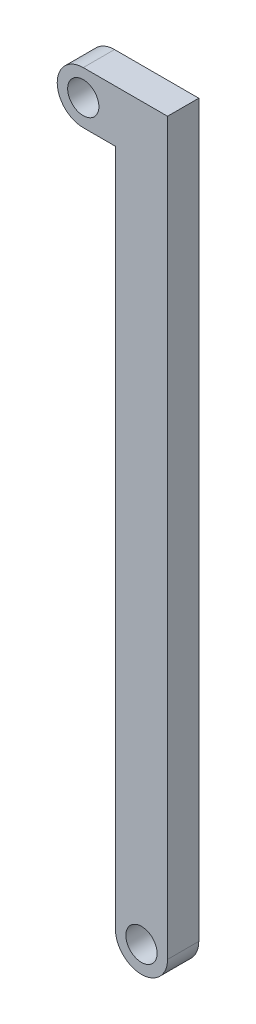
ISO-10303-21;
HEADER;
FILE_DESCRIPTION(('STEP AP214'),'2;1');
FILE_NAME('part.step','',(''),(''),'','','');
FILE_SCHEMA(('AUTOMOTIVE_DESIGN { 1 0 10303 214 1 1 1 1 }'));
ENDSEC;
DATA;
#1=APPLICATION_CONTEXT('core data for automotive mechanical design processes');
#2=APPLICATION_PROTOCOL_DEFINITION('international standard','automotive_design',2000,#1);
#3=PRODUCT_CONTEXT('',#1,'mechanical');
#4=PRODUCT('Part','Part','',(#3));
#5=PRODUCT_RELATED_PRODUCT_CATEGORY('part','',(#4));
#6=PRODUCT_DEFINITION_FORMATION('','',#4);
#7=PRODUCT_DEFINITION_CONTEXT('part definition',#1,'design');
#8=PRODUCT_DEFINITION('design','',#6,#7);
#9=PRODUCT_DEFINITION_SHAPE('','',#8);
#10=(LENGTH_UNIT() NAMED_UNIT(*) SI_UNIT(.MILLI.,.METRE.));
#11=(NAMED_UNIT(*) PLANE_ANGLE_UNIT() SI_UNIT($,.RADIAN.));
#12=(NAMED_UNIT(*) SI_UNIT($,.STERADIAN.) SOLID_ANGLE_UNIT());
#13=UNCERTAINTY_MEASURE_WITH_UNIT(LENGTH_MEASURE(1.E-05),#10,'distance_accuracy_value','');
#14=(GEOMETRIC_REPRESENTATION_CONTEXT(3) GLOBAL_UNCERTAINTY_ASSIGNED_CONTEXT((#13)) GLOBAL_UNIT_ASSIGNED_CONTEXT((#10,
#11,#12)) REPRESENTATION_CONTEXT('',''));
#15=CARTESIAN_POINT('',(0.,0.,0.));
#16=DIRECTION('',(0.,0.,1.));
#17=DIRECTION('',(1.,0.,0.));
#18=AXIS2_PLACEMENT_3D('',#15,#16,#17);
#19=CARTESIAN_POINT('',(-119.563888888889,71.4277777777778,30.));
#20=DIRECTION('',(0.,0.,-1.));
#21=DIRECTION('',(-1.,0.,0.));
#22=AXIS2_PLACEMENT_3D('',#19,#20,#21);
#23=PLANE('',#22);
#24=CARTESIAN_POINT('',(-119.563888888889,71.4277777777778,30.));
#25=DIRECTION('',(0.,0.,1.));
#26=DIRECTION('',(-1.,0.,0.));
#27=AXIS2_PLACEMENT_3D('',#24,#25,#26);
#28=CIRCLE('',#27,25.);
#29=CARTESIAN_POINT('',(-119.563888888889,96.4277777777778,30.));
#30=VERTEX_POINT('',#29);
#31=CARTESIAN_POINT('',(-119.563888888889,46.4277777777778,30.));
#32=VERTEX_POINT('',#31);
#33=EDGE_CURVE('E133',#30,#32,#28,.T.);
#34=ORIENTED_EDGE('',*,*,#33,.T.);
#35=DIRECTION('',(1.,0.,0.));
#36=VECTOR('',#35,1.);
#37=CARTESIAN_POINT('',(-119.563888888889,46.4277777777778,30.));
#38=LINE('',#37,#36);
#39=CARTESIAN_POINT('',(-88.663888888889,46.4277777777778,30.));
#40=VERTEX_POINT('',#39);
#41=EDGE_CURVE('E91',#32,#40,#38,.T.);
#42=ORIENTED_EDGE('',*,*,#41,.T.);
#43=DIRECTION('',(0.,-1.,0.));
#44=VECTOR('',#43,1.);
#45=CARTESIAN_POINT('',(-88.663888888889,46.4277777777778,30.));
#46=LINE('',#45,#44);
#47=CARTESIAN_POINT('',(-88.663888888889,-604.572222222222,30.));
#48=VERTEX_POINT('',#47);
#49=EDGE_CURVE('E104',#40,#48,#46,.T.);
#50=ORIENTED_EDGE('',*,*,#49,.T.);
#51=CARTESIAN_POINT('',(-63.6638888888889,-604.572222222222,30.));
#52=DIRECTION('',(0.,0.,1.));
#53=DIRECTION('',(1.,0.,0.));
#54=AXIS2_PLACEMENT_3D('',#51,#52,#53);
#55=CIRCLE('',#54,25.);
#56=CARTESIAN_POINT('',(-38.6638888888889,-604.572222222222,30.));
#57=VERTEX_POINT('',#56);
#58=EDGE_CURVE('E98',#48,#57,#55,.T.);
#59=ORIENTED_EDGE('',*,*,#58,.T.);
#60=DIRECTION('',(0.,1.,0.));
#61=VECTOR('',#60,1.);
#62=CARTESIAN_POINT('',(-38.663888888889,96.4277777777778,30.));
#63=LINE('',#62,#61);
#64=CARTESIAN_POINT('',(-38.663888888889,96.4277777777778,30.));
#65=VERTEX_POINT('',#64);
#66=EDGE_CURVE('E102',#57,#65,#63,.T.);
#67=ORIENTED_EDGE('',*,*,#66,.T.);
#68=DIRECTION('',(-1.,0.,0.));
#69=VECTOR('',#68,1.);
#70=CARTESIAN_POINT('',(-119.563888888889,96.4277777777778,30.));
#71=LINE('',#70,#69);
#72=EDGE_CURVE('E54',#65,#30,#71,.T.);
#73=ORIENTED_EDGE('',*,*,#72,.T.);
#74=EDGE_LOOP('',(#34,#42,#50,#59,#67,#73));
#75=FACE_BOUND('',#74,.T.);
#76=CARTESIAN_POINT('',(-119.563888888889,71.4277777777778,30.));
#77=DIRECTION('',(0.,0.,1.));
#78=DIRECTION('',(1.,0.,0.));
#79=AXIS2_PLACEMENT_3D('',#76,#77,#78);
#80=CIRCLE('',#79,15.);
#81=CARTESIAN_POINT('',(-104.563888888889,71.4277777777778,30.));
#82=VERTEX_POINT('',#81);
#83=EDGE_CURVE('E126',#82,#82,#80,.T.);
#84=ORIENTED_EDGE('',*,*,#83,.F.);
#85=EDGE_LOOP('',(#84));
#86=FACE_BOUND('',#85,.T.);
#87=CARTESIAN_POINT('',(-63.6638888888889,-604.572222222222,30.));
#88=DIRECTION('',(0.,0.,1.));
#89=DIRECTION('',(1.,0.,0.));
#90=AXIS2_PLACEMENT_3D('',#87,#88,#89);
#91=CIRCLE('',#90,15.);
#92=CARTESIAN_POINT('',(-48.6638888888889,-604.572222222222,30.));
#93=VERTEX_POINT('',#92);
#94=EDGE_CURVE('E174',#93,#93,#91,.T.);
#95=ORIENTED_EDGE('',*,*,#94,.F.);
#96=EDGE_LOOP('',(#95));
#97=FACE_BOUND('',#96,.T.);
#98=ADVANCED_FACE('F37',(#75,#86,#97),#23,.F.);
#99=CARTESIAN_POINT('',(-119.563888888889,71.4277777777778,0.));
#100=DIRECTION('',(0.,0.,-1.));
#101=DIRECTION('',(-1.,0.,0.));
#102=AXIS2_PLACEMENT_3D('',#99,#100,#101);
#103=PLANE('',#102);
#104=CARTESIAN_POINT('',(-119.563888888889,71.4277777777778,0.));
#105=DIRECTION('',(0.,0.,1.));
#106=DIRECTION('',(1.,0.,0.));
#107=AXIS2_PLACEMENT_3D('',#104,#105,#106);
#108=CIRCLE('',#107,15.);
#109=CARTESIAN_POINT('',(-104.563888888889,71.4277777777778,0.));
#110=VERTEX_POINT('',#109);
#111=EDGE_CURVE('E179',#110,#110,#108,.T.);
#112=ORIENTED_EDGE('',*,*,#111,.T.);
#113=EDGE_LOOP('',(#112));
#114=FACE_BOUND('',#113,.T.);
#115=CARTESIAN_POINT('',(-119.563888888889,71.4277777777778,0.));
#116=DIRECTION('',(0.,0.,1.));
#117=DIRECTION('',(-1.,0.,0.));
#118=AXIS2_PLACEMENT_3D('',#115,#116,#117);
#119=CIRCLE('',#118,25.);
#120=CARTESIAN_POINT('',(-119.563888888889,96.4277777777778,0.));
#121=VERTEX_POINT('',#120);
#122=CARTESIAN_POINT('',(-119.563888888889,46.4277777777778,0.));
#123=VERTEX_POINT('',#122);
#124=EDGE_CURVE('E122',#121,#123,#119,.T.);
#125=ORIENTED_EDGE('',*,*,#124,.F.);
#126=DIRECTION('',(-1.,0.,0.));
#127=VECTOR('',#126,1.);
#128=CARTESIAN_POINT('',(-119.563888888889,96.4277777777778,0.));
#129=LINE('',#128,#127);
#130=CARTESIAN_POINT('',(-38.663888888889,96.4277777777778,0.));
#131=VERTEX_POINT('',#130);
#132=EDGE_CURVE('E83',#131,#121,#129,.T.);
#133=ORIENTED_EDGE('',*,*,#132,.F.);
#134=DIRECTION('',(0.,1.,0.));
#135=VECTOR('',#134,1.);
#136=CARTESIAN_POINT('',(-38.663888888889,96.4277777777778,0.));
#137=LINE('',#136,#135);
#138=CARTESIAN_POINT('',(-38.6638888888889,-604.572222222222,0.));
#139=VERTEX_POINT('',#138);
#140=EDGE_CURVE('E77',#139,#131,#137,.T.);
#141=ORIENTED_EDGE('',*,*,#140,.F.);
#142=CARTESIAN_POINT('',(-63.6638888888889,-604.572222222222,0.));
#143=DIRECTION('',(0.,0.,1.));
#144=DIRECTION('',(1.,0.,0.));
#145=AXIS2_PLACEMENT_3D('',#142,#143,#144);
#146=CIRCLE('',#145,25.);
#147=CARTESIAN_POINT('',(-88.663888888889,-604.572222222222,0.));
#148=VERTEX_POINT('',#147);
#149=EDGE_CURVE('E112',#148,#139,#146,.T.);
#150=ORIENTED_EDGE('',*,*,#149,.F.);
#151=DIRECTION('',(0.,-1.,0.));
#152=VECTOR('',#151,1.);
#153=CARTESIAN_POINT('',(-88.663888888889,46.4277777777778,0.));
#154=LINE('',#153,#152);
#155=CARTESIAN_POINT('',(-88.663888888889,46.4277777777778,0.));
#156=VERTEX_POINT('',#155);
#157=EDGE_CURVE('E128',#156,#148,#154,.T.);
#158=ORIENTED_EDGE('',*,*,#157,.F.);
#159=DIRECTION('',(1.,0.,0.));
#160=VECTOR('',#159,1.);
#161=CARTESIAN_POINT('',(-119.563888888889,46.4277777777778,0.));
#162=LINE('',#161,#160);
#163=EDGE_CURVE('E125',#123,#156,#162,.T.);
#164=ORIENTED_EDGE('',*,*,#163,.F.);
#165=EDGE_LOOP('',(#125,#133,#141,#150,#158,#164));
#166=FACE_BOUND('',#165,.T.);
#167=CARTESIAN_POINT('',(-63.6638888888889,-604.572222222222,0.));
#168=DIRECTION('',(0.,0.,1.));
#169=DIRECTION('',(1.,0.,0.));
#170=AXIS2_PLACEMENT_3D('',#167,#168,#169);
#171=CIRCLE('',#170,15.);
#172=CARTESIAN_POINT('',(-48.6638888888889,-604.572222222222,0.));
#173=VERTEX_POINT('',#172);
#174=EDGE_CURVE('E177',#173,#173,#171,.T.);
#175=ORIENTED_EDGE('',*,*,#174,.T.);
#176=EDGE_LOOP('',(#175));
#177=FACE_BOUND('',#176,.T.);
#178=ADVANCED_FACE('F142',(#114,#166,#177),#103,.T.);
#179=CARTESIAN_POINT('',(-119.563888888889,71.4277777777778,30.));
#180=DIRECTION('',(0.,0.,-1.));
#181=DIRECTION('',(-1.,0.,0.));
#182=AXIS2_PLACEMENT_3D('',#179,#180,#181);
#183=CYLINDRICAL_SURFACE('',#182,25.);
#184=ORIENTED_EDGE('',*,*,#124,.T.);
#185=DIRECTION('',(0.,0.,-1.));
#186=VECTOR('',#185,1.);
#187=CARTESIAN_POINT('',(-119.563888888889,46.4277777777778,30.));
#188=LINE('',#187,#186);
#189=EDGE_CURVE('E11',#32,#123,#188,.T.);
#190=ORIENTED_EDGE('',*,*,#189,.F.);
#191=ORIENTED_EDGE('',*,*,#33,.F.);
#192=DIRECTION('',(0.,0.,-1.));
#193=VECTOR('',#192,1.);
#194=CARTESIAN_POINT('',(-119.563888888889,96.4277777777778,30.));
#195=LINE('',#194,#193);
#196=EDGE_CURVE('E118',#30,#121,#195,.T.);
#197=ORIENTED_EDGE('',*,*,#196,.T.);
#198=EDGE_LOOP('',(#184,#190,#191,#197));
#199=FACE_BOUND('',#198,.T.);
#200=ADVANCED_FACE('F39',(#199),#183,.T.);
#201=CARTESIAN_POINT('',(-119.563888888889,46.4277777777778,30.));
#202=DIRECTION('',(0.,1.,0.));
#203=DIRECTION('',(0.,0.,1.));
#204=AXIS2_PLACEMENT_3D('',#201,#202,#203);
#205=PLANE('',#204);
#206=ORIENTED_EDGE('',*,*,#163,.T.);
#207=DIRECTION('',(0.,0.,-1.));
#208=VECTOR('',#207,1.);
#209=CARTESIAN_POINT('',(-88.663888888889,46.4277777777778,30.));
#210=LINE('',#209,#208);
#211=EDGE_CURVE('E46',#40,#156,#210,.T.);
#212=ORIENTED_EDGE('',*,*,#211,.F.);
#213=ORIENTED_EDGE('',*,*,#41,.F.);
#214=ORIENTED_EDGE('',*,*,#189,.T.);
#215=EDGE_LOOP('',(#206,#212,#213,#214));
#216=FACE_BOUND('',#215,.T.);
#217=ADVANCED_FACE('F226',(#216),#205,.F.);
#218=CARTESIAN_POINT('',(-88.663888888889,46.4277777777778,30.));
#219=DIRECTION('',(1.,0.,0.));
#220=DIRECTION('',(0.,0.,-1.));
#221=AXIS2_PLACEMENT_3D('',#218,#219,#220);
#222=PLANE('',#221);
#223=ORIENTED_EDGE('',*,*,#157,.T.);
#224=DIRECTION('',(0.,0.,-1.));
#225=VECTOR('',#224,1.);
#226=CARTESIAN_POINT('',(-88.663888888889,-604.572222222222,30.));
#227=LINE('',#226,#225);
#228=EDGE_CURVE('E113',#48,#148,#227,.T.);
#229=ORIENTED_EDGE('',*,*,#228,.F.);
#230=ORIENTED_EDGE('',*,*,#49,.F.);
#231=ORIENTED_EDGE('',*,*,#211,.T.);
#232=EDGE_LOOP('',(#223,#229,#230,#231));
#233=FACE_BOUND('',#232,.T.);
#234=ADVANCED_FACE('F139',(#233),#222,.F.);
#235=CARTESIAN_POINT('',(-63.6638888888889,-604.572222222222,30.));
#236=DIRECTION('',(0.,0.,-1.));
#237=DIRECTION('',(-1.,0.,0.));
#238=AXIS2_PLACEMENT_3D('',#235,#236,#237);
#239=CYLINDRICAL_SURFACE('',#238,25.);
#240=ORIENTED_EDGE('',*,*,#149,.T.);
#241=DIRECTION('',(0.,0.,-1.));
#242=VECTOR('',#241,1.);
#243=CARTESIAN_POINT('',(-38.6638888888889,-604.572222222222,30.));
#244=LINE('',#243,#242);
#245=EDGE_CURVE('E109',#57,#139,#244,.T.);
#246=ORIENTED_EDGE('',*,*,#245,.F.);
#247=ORIENTED_EDGE('',*,*,#58,.F.);
#248=ORIENTED_EDGE('',*,*,#228,.T.);
#249=EDGE_LOOP('',(#240,#246,#247,#248));
#250=FACE_BOUND('',#249,.T.);
#251=ADVANCED_FACE('F110',(#250),#239,.T.);
#252=CARTESIAN_POINT('',(-38.663888888889,96.4277777777778,30.));
#253=DIRECTION('',(-1.,0.,0.));
#254=DIRECTION('',(0.,0.,1.));
#255=AXIS2_PLACEMENT_3D('',#252,#253,#254);
#256=PLANE('',#255);
#257=ORIENTED_EDGE('',*,*,#140,.T.);
#258=DIRECTION('',(0.,0.,-1.));
#259=VECTOR('',#258,1.);
#260=CARTESIAN_POINT('',(-38.663888888889,96.4277777777778,30.));
#261=LINE('',#260,#259);
#262=EDGE_CURVE('E114',#65,#131,#261,.T.);
#263=ORIENTED_EDGE('',*,*,#262,.F.);
#264=ORIENTED_EDGE('',*,*,#66,.F.);
#265=ORIENTED_EDGE('',*,*,#245,.T.);
#266=EDGE_LOOP('',(#257,#263,#264,#265));
#267=FACE_BOUND('',#266,.T.);
#268=ADVANCED_FACE('F116',(#267),#256,.F.);
#269=CARTESIAN_POINT('',(-119.563888888889,96.4277777777778,30.));
#270=DIRECTION('',(0.,-1.,0.));
#271=DIRECTION('',(0.,0.,-1.));
#272=AXIS2_PLACEMENT_3D('',#269,#270,#271);
#273=PLANE('',#272);
#274=ORIENTED_EDGE('',*,*,#132,.T.);
#275=ORIENTED_EDGE('',*,*,#196,.F.);
#276=ORIENTED_EDGE('',*,*,#72,.F.);
#277=ORIENTED_EDGE('',*,*,#262,.T.);
#278=EDGE_LOOP('',(#274,#275,#276,#277));
#279=FACE_BOUND('',#278,.T.);
#280=ADVANCED_FACE('F147',(#279),#273,.F.);
#281=CARTESIAN_POINT('',(-119.563888888889,71.4277777777778,30.));
#282=DIRECTION('',(0.,0.,-1.));
#283=DIRECTION('',(-1.,0.,0.));
#284=AXIS2_PLACEMENT_3D('',#281,#282,#283);
#285=CYLINDRICAL_SURFACE('',#284,15.);
#286=ORIENTED_EDGE('',*,*,#83,.T.);
#287=EDGE_LOOP('',(#286));
#288=FACE_BOUND('',#287,.T.);
#289=ORIENTED_EDGE('',*,*,#111,.F.);
#290=EDGE_LOOP('',(#289));
#291=FACE_BOUND('',#290,.T.);
#292=ADVANCED_FACE('F149',(#288,#291),#285,.F.);
#293=CARTESIAN_POINT('',(-63.6638888888889,-604.572222222222,30.));
#294=DIRECTION('',(0.,0.,-1.));
#295=DIRECTION('',(-1.,0.,0.));
#296=AXIS2_PLACEMENT_3D('',#293,#294,#295);
#297=CYLINDRICAL_SURFACE('',#296,15.);
#298=ORIENTED_EDGE('',*,*,#94,.T.);
#299=EDGE_LOOP('',(#298));
#300=FACE_BOUND('',#299,.T.);
#301=ORIENTED_EDGE('',*,*,#174,.F.);
#302=EDGE_LOOP('',(#301));
#303=FACE_BOUND('',#302,.T.);
#304=ADVANCED_FACE('F155',(#300,#303),#297,.F.);
#305=CLOSED_SHELL('',(#98,#178,#200,#217,#234,#251,#268,#280,#292,#304));
#306=MANIFOLD_SOLID_BREP('B2',#305);
#307=ADVANCED_BREP_SHAPE_REPRESENTATION('',(#18,#306),#14);
#308=SHAPE_DEFINITION_REPRESENTATION(#9,#307);
ENDSEC;
END-ISO-10303-21;
